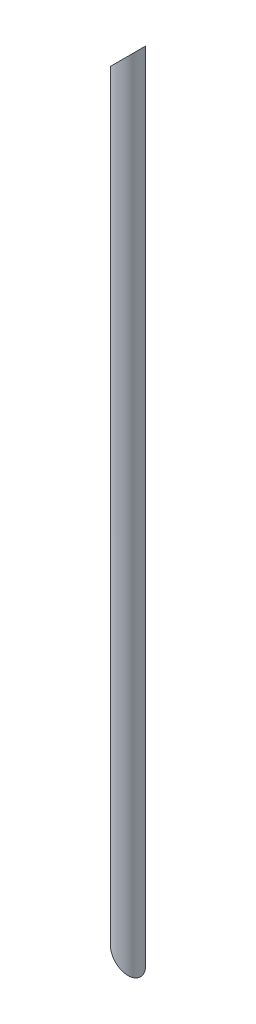
ISO-10303-21;
HEADER;
FILE_DESCRIPTION(('STEP AP214'),'2;1');
FILE_NAME('part.step','',(''),(''),'','','');
FILE_SCHEMA(('AUTOMOTIVE_DESIGN { 1 0 10303 214 1 1 1 1 }'));
ENDSEC;
DATA;
#1=APPLICATION_CONTEXT('core data for automotive mechanical design processes');
#2=APPLICATION_PROTOCOL_DEFINITION('international standard','automotive_design',2000,#1);
#3=PRODUCT_CONTEXT('',#1,'mechanical');
#4=PRODUCT('Part','Part','',(#3));
#5=PRODUCT_RELATED_PRODUCT_CATEGORY('part','',(#4));
#6=PRODUCT_DEFINITION_FORMATION('','',#4);
#7=PRODUCT_DEFINITION_CONTEXT('part definition',#1,'design');
#8=PRODUCT_DEFINITION('design','',#6,#7);
#9=PRODUCT_DEFINITION_SHAPE('','',#8);
#10=(LENGTH_UNIT() NAMED_UNIT(*) SI_UNIT(.MILLI.,.METRE.));
#11=(NAMED_UNIT(*) PLANE_ANGLE_UNIT() SI_UNIT($,.RADIAN.));
#12=(NAMED_UNIT(*) SI_UNIT($,.STERADIAN.) SOLID_ANGLE_UNIT());
#13=UNCERTAINTY_MEASURE_WITH_UNIT(LENGTH_MEASURE(1.E-05),#10,'distance_accuracy_value','');
#14=(GEOMETRIC_REPRESENTATION_CONTEXT(3) GLOBAL_UNCERTAINTY_ASSIGNED_CONTEXT((#13)) GLOBAL_UNIT_ASSIGNED_CONTEXT((#10,
#11,#12)) REPRESENTATION_CONTEXT('',''));
#15=CARTESIAN_POINT('',(0.,0.,0.));
#16=DIRECTION('',(0.,0.,1.));
#17=DIRECTION('',(1.,0.,0.));
#18=AXIS2_PLACEMENT_3D('',#15,#16,#17);
#19=CARTESIAN_POINT('',(0.,0.,0.));
#20=DIRECTION('',(0.,-1.,0.));
#21=DIRECTION('',(1.,0.,0.));
#22=AXIS2_PLACEMENT_3D('',#19,#20,#21);
#23=CYLINDRICAL_SURFACE('',#22,39.3);
#24=CARTESIAN_POINT('',(-7.65087474284668E-13,2491.41,0.));
#25=DIRECTION('',(0.707106781186546,-0.707106781186549,0.));
#26=DIRECTION('',(-0.707106781186549,-0.707106781186546,0.));
#27=AXIS2_PLACEMENT_3D('',#24,#25,#26);
#28=ELLIPSE('',#27,55.5785930012625,39.3);
#29=CARTESIAN_POINT('',(-39.3000000000007,2452.11,0.));
#30=VERTEX_POINT('',#29);
#31=EDGE_CURVE('E45',#30,#30,#28,.F.);
#32=ORIENTED_EDGE('',*,*,#31,.F.);
#33=EDGE_LOOP('',(#32));
#34=FACE_BOUND('',#33,.T.);
#35=CARTESIAN_POINT('',(0.,39.2999999999997,0.));
#36=DIRECTION('',(0.707106781186545,0.70710678118655,0.));
#37=DIRECTION('',(0.70710678118655,-0.707106781186545,0.));
#38=AXIS2_PLACEMENT_3D('',#35,#36,#37);
#39=ELLIPSE('',#38,55.5785930012625,39.3);
#40=CARTESIAN_POINT('',(39.3,0.,0.));
#41=VERTEX_POINT('',#40);
#42=EDGE_CURVE('E10',#41,#41,#39,.F.);
#43=ORIENTED_EDGE('',*,*,#42,.F.);
#44=EDGE_LOOP('',(#43));
#45=FACE_BOUND('',#44,.T.);
#46=ADVANCED_FACE('F37',(#34,#45),#23,.T.);
#47=CARTESIAN_POINT('',(39.3,0.,-39.3));
#48=DIRECTION('',(0.707106781186545,0.70710678118655,0.));
#49=DIRECTION('',(-0.70710678118655,0.707106781186545,0.));
#50=AXIS2_PLACEMENT_3D('',#47,#48,#49);
#51=PLANE('',#50);
#52=CARTESIAN_POINT('',(0.,39.2999999999999,0.));
#53=DIRECTION('',(0.707106781186545,0.70710678118655,0.));
#54=DIRECTION('',(0.70710678118655,-0.707106781186545,0.));
#55=AXIS2_PLACEMENT_3D('',#52,#53,#54);
#56=ELLIPSE('',#55,50.7331882458139,35.8737814398288);
#57=CARTESIAN_POINT('',(35.8737814398288,3.42621856017135,0.));
#58=VERTEX_POINT('',#57);
#59=EDGE_CURVE('E50',#58,#58,#56,.F.);
#60=ORIENTED_EDGE('',*,*,#59,.F.);
#61=EDGE_LOOP('',(#60));
#62=FACE_BOUND('',#61,.T.);
#63=ORIENTED_EDGE('',*,*,#42,.T.);
#64=EDGE_LOOP('',(#63));
#65=FACE_BOUND('',#64,.T.);
#66=ADVANCED_FACE('F66',(#62,#65),#51,.F.);
#67=CARTESIAN_POINT('',(39.2999999999992,2530.71,-39.3));
#68=DIRECTION('',(0.707106781186546,-0.707106781186549,0.));
#69=DIRECTION('',(0.707106781186549,0.707106781186546,0.));
#70=AXIS2_PLACEMENT_3D('',#67,#68,#69);
#71=PLANE('',#70);
#72=CARTESIAN_POINT('',(0.,2491.41,0.));
#73=DIRECTION('',(0.707106781186546,-0.707106781186549,0.));
#74=DIRECTION('',(-0.707106781186549,-0.707106781186546,0.));
#75=AXIS2_PLACEMENT_3D('',#72,#73,#74);
#76=ELLIPSE('',#75,50.733188245814,35.8737814398288);
#77=CARTESIAN_POINT('',(-35.8737814398288,2455.53621856017,0.));
#78=VERTEX_POINT('',#77);
#79=EDGE_CURVE('E40',#78,#78,#76,.F.);
#80=ORIENTED_EDGE('',*,*,#79,.F.);
#81=EDGE_LOOP('',(#80));
#82=FACE_BOUND('',#81,.T.);
#83=ORIENTED_EDGE('',*,*,#31,.T.);
#84=EDGE_LOOP('',(#83));
#85=FACE_BOUND('',#84,.T.);
#86=ADVANCED_FACE('F63',(#82,#85),#71,.F.);
#87=CARTESIAN_POINT('',(0.,2530.71,0.));
#88=DIRECTION('',(0.,-1.,0.));
#89=DIRECTION('',(0.,0.,-1.));
#90=AXIS2_PLACEMENT_3D('',#87,#88,#89);
#91=CYLINDRICAL_SURFACE('',#90,35.8737814398288);
#92=ORIENTED_EDGE('',*,*,#79,.T.);
#93=EDGE_LOOP('',(#92));
#94=FACE_BOUND('',#93,.T.);
#95=ORIENTED_EDGE('',*,*,#59,.T.);
#96=EDGE_LOOP('',(#95));
#97=FACE_BOUND('',#96,.T.);
#98=ADVANCED_FACE('F61',(#94,#97),#91,.F.);
#99=CLOSED_SHELL('',(#46,#66,#86,#98));
#100=MANIFOLD_SOLID_BREP('B2',#99);
#101=ADVANCED_BREP_SHAPE_REPRESENTATION('',(#18,#100),#14);
#102=SHAPE_DEFINITION_REPRESENTATION(#9,#101);
ENDSEC;
END-ISO-10303-21;
